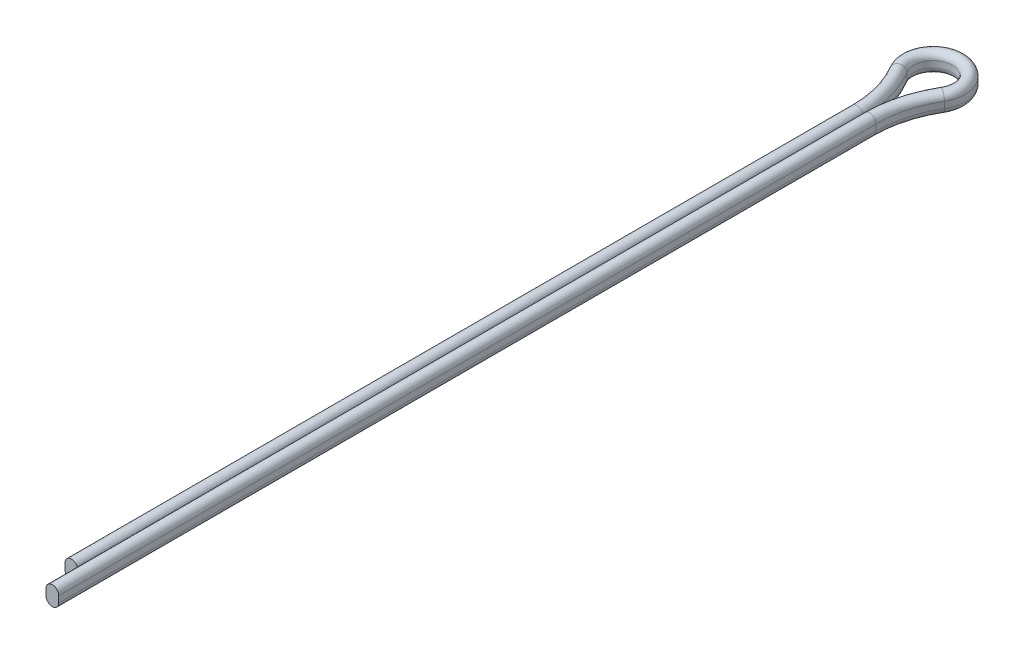
ISO-10303-21;
HEADER;
FILE_DESCRIPTION(('STEP AP214'),'2;1');
FILE_NAME('part.step','',(''),(''),'','','');
FILE_SCHEMA(('AUTOMOTIVE_DESIGN { 1 0 10303 214 1 1 1 1 }'));
ENDSEC;
DATA;
#1=APPLICATION_CONTEXT('core data for automotive mechanical design processes');
#2=APPLICATION_PROTOCOL_DEFINITION('international standard','automotive_design',2000,#1);
#3=PRODUCT_CONTEXT('',#1,'mechanical');
#4=PRODUCT('Part','Part','',(#3));
#5=PRODUCT_RELATED_PRODUCT_CATEGORY('part','',(#4));
#6=PRODUCT_DEFINITION_FORMATION('','',#4);
#7=PRODUCT_DEFINITION_CONTEXT('part definition',#1,'design');
#8=PRODUCT_DEFINITION('design','',#6,#7);
#9=PRODUCT_DEFINITION_SHAPE('','',#8);
#10=(LENGTH_UNIT() NAMED_UNIT(*) SI_UNIT(.MILLI.,.METRE.));
#11=(NAMED_UNIT(*) PLANE_ANGLE_UNIT() SI_UNIT($,.RADIAN.));
#12=(NAMED_UNIT(*) SI_UNIT($,.STERADIAN.) SOLID_ANGLE_UNIT());
#13=UNCERTAINTY_MEASURE_WITH_UNIT(LENGTH_MEASURE(1.E-05),#10,'distance_accuracy_value','');
#14=(GEOMETRIC_REPRESENTATION_CONTEXT(3) GLOBAL_UNCERTAINTY_ASSIGNED_CONTEXT((#13)) GLOBAL_UNIT_ASSIGNED_CONTEXT((#10,
#11,#12)) REPRESENTATION_CONTEXT('',''));
#15=CARTESIAN_POINT('',(0.,0.,0.));
#16=DIRECTION('',(0.,0.,1.));
#17=DIRECTION('',(1.,0.,0.));
#18=AXIS2_PLACEMENT_3D('',#15,#16,#17);
#19=CARTESIAN_POINT('',(0.,-0.2,-51.5));
#20=DIRECTION('',(-1.,0.,0.));
#21=DIRECTION('',(0.,0.,1.));
#22=AXIS2_PLACEMENT_3D('',#19,#20,#21);
#23=PLANE('',#22);
#24=DIRECTION('',(0.,-1.,0.));
#25=VECTOR('',#24,1.);
#26=CARTESIAN_POINT('',(0.,-0.2,-51.5));
#27=LINE('',#26,#25);
#28=CARTESIAN_POINT('',(0.,0.2,-51.5));
#29=VERTEX_POINT('',#28);
#30=CARTESIAN_POINT('',(0.,-0.2,-51.5));
#31=VERTEX_POINT('',#30);
#32=EDGE_CURVE('E225',#29,#31,#27,.T.);
#33=ORIENTED_EDGE('',*,*,#32,.F.);
#34=DIRECTION('',(0.,0.,1.));
#35=VECTOR('',#34,1.);
#36=CARTESIAN_POINT('',(0.,0.2,-51.5));
#37=LINE('',#36,#35);
#38=CARTESIAN_POINT('',(0.,0.2,-1.99999999999998));
#39=VERTEX_POINT('',#38);
#40=EDGE_CURVE('E40',#29,#39,#37,.T.);
#41=ORIENTED_EDGE('',*,*,#40,.T.);
#42=DIRECTION('',(0.,-1.,0.));
#43=VECTOR('',#42,1.);
#44=CARTESIAN_POINT('',(0.,-0.2,-1.99999999999998));
#45=LINE('',#44,#43);
#46=CARTESIAN_POINT('',(0.,-0.2,-1.99999999999998));
#47=VERTEX_POINT('',#46);
#48=EDGE_CURVE('E47',#39,#47,#45,.T.);
#49=ORIENTED_EDGE('',*,*,#48,.T.);
#50=DIRECTION('',(0.,0.,1.));
#51=VECTOR('',#50,1.);
#52=CARTESIAN_POINT('',(0.,-0.2,-51.5));
#53=LINE('',#52,#51);
#54=EDGE_CURVE('E11',#31,#47,#53,.T.);
#55=ORIENTED_EDGE('',*,*,#54,.F.);
#56=EDGE_LOOP('',(#33,#41,#49,#55));
#57=FACE_BOUND('',#56,.T.);
#58=ADVANCED_FACE('F33',(#57),#23,.F.);
#59=CARTESIAN_POINT('',(-0.400000000000008,0.2,-51.5));
#60=DIRECTION('',(0.,0.,1.));
#61=DIRECTION('',(1.,0.,0.));
#62=AXIS2_PLACEMENT_3D('',#59,#60,#61);
#63=CYLINDRICAL_SURFACE('',#62,0.4);
#64=CARTESIAN_POINT('',(-0.400000000000008,0.2,-51.5));
#65=DIRECTION('',(0.,0.,-1.));
#66=DIRECTION('',(-1.,0.,0.));
#67=AXIS2_PLACEMENT_3D('',#64,#65,#66);
#68=CIRCLE('',#67,0.4);
#69=CARTESIAN_POINT('',(-0.800000000000009,0.2,-51.5));
#70=VERTEX_POINT('',#69);
#71=EDGE_CURVE('E222',#70,#29,#68,.T.);
#72=ORIENTED_EDGE('',*,*,#71,.F.);
#73=DIRECTION('',(0.,0.,1.));
#74=VECTOR('',#73,1.);
#75=CARTESIAN_POINT('',(-0.800000000000009,0.2,-51.5));
#76=LINE('',#75,#74);
#77=CARTESIAN_POINT('',(-0.800000000000002,0.2,-1.99999999999998));
#78=VERTEX_POINT('',#77);
#79=EDGE_CURVE('E249',#70,#78,#76,.T.);
#80=ORIENTED_EDGE('',*,*,#79,.T.);
#81=CARTESIAN_POINT('',(-0.400000000000001,0.2,-1.99999999999998));
#82=DIRECTION('',(0.,0.,-1.));
#83=DIRECTION('',(-1.,0.,0.));
#84=AXIS2_PLACEMENT_3D('',#81,#82,#83);
#85=CIRCLE('',#84,0.4);
#86=EDGE_CURVE('E55',#78,#39,#85,.T.);
#87=ORIENTED_EDGE('',*,*,#86,.T.);
#88=ORIENTED_EDGE('',*,*,#40,.F.);
#89=EDGE_LOOP('',(#72,#80,#87,#88));
#90=FACE_BOUND('',#89,.T.);
#91=ADVANCED_FACE('F252',(#90),#63,.T.);
#92=CARTESIAN_POINT('',(-0.800000000000009,-0.2,-51.5));
#93=DIRECTION('',(1.,0.,0.));
#94=DIRECTION('',(0.,0.,-1.));
#95=AXIS2_PLACEMENT_3D('',#92,#93,#94);
#96=PLANE('',#95);
#97=DIRECTION('',(0.,1.,0.));
#98=VECTOR('',#97,1.);
#99=CARTESIAN_POINT('',(-0.800000000000009,-0.2,-51.5));
#100=LINE('',#99,#98);
#101=CARTESIAN_POINT('',(-0.800000000000009,-0.2,-51.5));
#102=VERTEX_POINT('',#101);
#103=EDGE_CURVE('E219',#102,#70,#100,.T.);
#104=ORIENTED_EDGE('',*,*,#103,.F.);
#105=DIRECTION('',(0.,0.,1.));
#106=VECTOR('',#105,1.);
#107=CARTESIAN_POINT('',(-0.800000000000009,-0.2,-51.5));
#108=LINE('',#107,#106);
#109=CARTESIAN_POINT('',(-0.800000000000002,-0.2,-1.99999999999998));
#110=VERTEX_POINT('',#109);
#111=EDGE_CURVE('E246',#102,#110,#108,.T.);
#112=ORIENTED_EDGE('',*,*,#111,.T.);
#113=DIRECTION('',(0.,1.,0.));
#114=VECTOR('',#113,1.);
#115=CARTESIAN_POINT('',(-0.800000000000002,-0.2,-1.99999999999998));
#116=LINE('',#115,#114);
#117=EDGE_CURVE('E242',#110,#78,#116,.T.);
#118=ORIENTED_EDGE('',*,*,#117,.T.);
#119=ORIENTED_EDGE('',*,*,#79,.F.);
#120=EDGE_LOOP('',(#104,#112,#118,#119));
#121=FACE_BOUND('',#120,.T.);
#122=ADVANCED_FACE('F303',(#121),#96,.F.);
#123=CARTESIAN_POINT('',(-0.400000000000008,-0.2,-51.5));
#124=DIRECTION('',(0.,0.,1.));
#125=DIRECTION('',(1.,0.,0.));
#126=AXIS2_PLACEMENT_3D('',#123,#124,#125);
#127=CYLINDRICAL_SURFACE('',#126,0.4);
#128=CARTESIAN_POINT('',(-0.400000000000008,-0.2,-51.5));
#129=DIRECTION('',(0.,0.,-1.));
#130=DIRECTION('',(-1.,0.,0.));
#131=AXIS2_PLACEMENT_3D('',#128,#129,#130);
#132=CIRCLE('',#131,0.4);
#133=EDGE_CURVE('E216',#31,#102,#132,.T.);
#134=ORIENTED_EDGE('',*,*,#133,.F.);
#135=ORIENTED_EDGE('',*,*,#54,.T.);
#136=CARTESIAN_POINT('',(-0.400000000000001,-0.2,-1.99999999999998));
#137=DIRECTION('',(0.,0.,-1.));
#138=DIRECTION('',(-1.,0.,0.));
#139=AXIS2_PLACEMENT_3D('',#136,#137,#138);
#140=CIRCLE('',#139,0.4);
#141=EDGE_CURVE('E240',#47,#110,#140,.T.);
#142=ORIENTED_EDGE('',*,*,#141,.T.);
#143=ORIENTED_EDGE('',*,*,#111,.F.);
#144=EDGE_LOOP('',(#134,#135,#142,#143));
#145=FACE_BOUND('',#144,.T.);
#146=ADVANCED_FACE('F293',(#145),#127,.T.);
#147=CARTESIAN_POINT('',(-7.46666666666668,0.,-51.5));
#148=DIRECTION('',(0.,-1.,0.));
#149=DIRECTION('',(0.,0.,-1.));
#150=AXIS2_PLACEMENT_3D('',#147,#148,#149);
#151=CYLINDRICAL_SURFACE('',#150,7.46666666666666);
#152=DIRECTION('',(0.,-1.,0.));
#153=VECTOR('',#152,1.);
#154=CARTESIAN_POINT('',(-1.03384615384616,-0.2,-55.2907692307692));
#155=LINE('',#154,#153);
#156=CARTESIAN_POINT('',(-1.03384615384616,0.2,-55.2907692307692));
#157=VERTEX_POINT('',#156);
#158=CARTESIAN_POINT('',(-1.03384615384616,-0.2,-55.2907692307692));
#159=VERTEX_POINT('',#158);
#160=EDGE_CURVE('E201',#157,#159,#155,.T.);
#161=ORIENTED_EDGE('',*,*,#160,.F.);
#162=CARTESIAN_POINT('',(-7.46666666666668,0.2,-51.5));
#163=DIRECTION('',(0.,-1.,0.));
#164=DIRECTION('',(0.,0.,-1.));
#165=AXIS2_PLACEMENT_3D('',#162,#163,#164);
#166=CIRCLE('',#165,7.46666666666666);
#167=EDGE_CURVE('E234',#157,#29,#166,.T.);
#168=ORIENTED_EDGE('',*,*,#167,.T.);
#169=ORIENTED_EDGE('',*,*,#32,.T.);
#170=CARTESIAN_POINT('',(-7.46666666666668,-0.2,-51.5));
#171=DIRECTION('',(0.,-1.,0.));
#172=DIRECTION('',(0.,0.,-1.));
#173=AXIS2_PLACEMENT_3D('',#170,#171,#172);
#174=CIRCLE('',#173,7.46666666666666);
#175=EDGE_CURVE('E237',#159,#31,#174,.T.);
#176=ORIENTED_EDGE('',*,*,#175,.F.);
#177=EDGE_LOOP('',(#161,#168,#169,#176));
#178=FACE_BOUND('',#177,.T.);
#179=ADVANCED_FACE('F295',(#178),#151,.T.);
#180=CARTESIAN_POINT('',(-7.46666666666668,0.2,-51.5));
#181=DIRECTION('',(0.,-1.,0.));
#182=DIRECTION('',(0.,0.,-1.));
#183=AXIS2_PLACEMENT_3D('',#180,#181,#182);
#184=TOROIDAL_SURFACE('',#183,7.06666666666667,0.4);
#185=CARTESIAN_POINT('',(-1.37846153846154,0.2,-55.0876923076923));
#186=DIRECTION('',(-0.507692307692317,0.,-0.861538461538456));
#187=DIRECTION('',(-0.861538461538456,0.,0.507692307692317));
#188=AXIS2_PLACEMENT_3D('',#185,#186,#187);
#189=CIRCLE('',#188,0.4);
#190=CARTESIAN_POINT('',(-1.72307692307692,0.2,-54.8846153846154));
#191=VERTEX_POINT('',#190);
#192=EDGE_CURVE('E198',#191,#157,#189,.T.);
#193=ORIENTED_EDGE('',*,*,#192,.F.);
#194=CARTESIAN_POINT('',(-7.46666666666668,0.2,-51.5));
#195=DIRECTION('',(0.,-1.,0.));
#196=DIRECTION('',(0.,0.,-1.));
#197=AXIS2_PLACEMENT_3D('',#194,#195,#196);
#198=CIRCLE('',#197,6.66666666666667);
#199=EDGE_CURVE('E231',#191,#70,#198,.T.);
#200=ORIENTED_EDGE('',*,*,#199,.T.);
#201=ORIENTED_EDGE('',*,*,#71,.T.);
#202=ORIENTED_EDGE('',*,*,#167,.F.);
#203=EDGE_LOOP('',(#193,#200,#201,#202));
#204=FACE_BOUND('',#203,.T.);
#205=ADVANCED_FACE('F260',(#204),#184,.T.);
#206=CARTESIAN_POINT('',(-7.46666666666668,0.,-51.5));
#207=DIRECTION('',(0.,-1.,0.));
#208=DIRECTION('',(0.,0.,-1.));
#209=AXIS2_PLACEMENT_3D('',#206,#207,#208);
#210=CYLINDRICAL_SURFACE('',#209,6.66666666666667);
#211=DIRECTION('',(0.,1.,0.));
#212=VECTOR('',#211,1.);
#213=CARTESIAN_POINT('',(-1.72307692307692,-0.2,-54.8846153846154));
#214=LINE('',#213,#212);
#215=CARTESIAN_POINT('',(-1.72307692307692,-0.2,-54.8846153846154));
#216=VERTEX_POINT('',#215);
#217=EDGE_CURVE('E195',#216,#191,#214,.T.);
#218=ORIENTED_EDGE('',*,*,#217,.F.);
#219=CARTESIAN_POINT('',(-7.46666666666668,-0.2,-51.5));
#220=DIRECTION('',(0.,-1.,0.));
#221=DIRECTION('',(0.,0.,-1.));
#222=AXIS2_PLACEMENT_3D('',#219,#220,#221);
#223=CIRCLE('',#222,6.66666666666667);
#224=EDGE_CURVE('E228',#216,#102,#223,.T.);
#225=ORIENTED_EDGE('',*,*,#224,.T.);
#226=ORIENTED_EDGE('',*,*,#103,.T.);
#227=ORIENTED_EDGE('',*,*,#199,.F.);
#228=EDGE_LOOP('',(#218,#225,#226,#227));
#229=FACE_BOUND('',#228,.T.);
#230=ADVANCED_FACE('F257',(#229),#210,.F.);
#231=CARTESIAN_POINT('',(-7.46666666666668,-0.2,-51.5));
#232=DIRECTION('',(0.,-1.,0.));
#233=DIRECTION('',(0.,0.,-1.));
#234=AXIS2_PLACEMENT_3D('',#231,#232,#233);
#235=TOROIDAL_SURFACE('',#234,7.06666666666667,0.4);
#236=CARTESIAN_POINT('',(-1.37846153846154,-0.2,-55.0876923076923));
#237=DIRECTION('',(-0.507692307692317,0.,-0.861538461538456));
#238=DIRECTION('',(-0.861538461538456,0.,0.507692307692317));
#239=AXIS2_PLACEMENT_3D('',#236,#237,#238);
#240=CIRCLE('',#239,0.4);
#241=EDGE_CURVE('E192',#159,#216,#240,.T.);
#242=ORIENTED_EDGE('',*,*,#241,.F.);
#243=ORIENTED_EDGE('',*,*,#175,.T.);
#244=ORIENTED_EDGE('',*,*,#133,.T.);
#245=ORIENTED_EDGE('',*,*,#224,.F.);
#246=EDGE_LOOP('',(#242,#243,#244,#245));
#247=FACE_BOUND('',#246,.T.);
#248=ADVANCED_FACE('F290',(#247),#235,.T.);
#249=CARTESIAN_POINT('',(0.,0.,-55.9));
#250=DIRECTION('',(0.,1.,0.));
#251=DIRECTION('',(0.,0.,1.));
#252=AXIS2_PLACEMENT_3D('',#249,#250,#251);
#253=CYLINDRICAL_SURFACE('',#252,1.2);
#254=DIRECTION('',(0.,-1.,0.));
#255=VECTOR('',#254,1.);
#256=CARTESIAN_POINT('',(1.03384615384615,-0.2,-55.2907692307692));
#257=LINE('',#256,#255);
#258=CARTESIAN_POINT('',(1.03384615384615,0.2,-55.2907692307692));
#259=VERTEX_POINT('',#258);
#260=CARTESIAN_POINT('',(1.03384615384615,-0.2,-55.2907692307692));
#261=VERTEX_POINT('',#260);
#262=EDGE_CURVE('E135',#259,#261,#257,.T.);
#263=ORIENTED_EDGE('',*,*,#262,.F.);
#264=CARTESIAN_POINT('',(0.,0.2,-55.9));
#265=DIRECTION('',(0.,1.,0.));
#266=DIRECTION('',(0.,0.,1.));
#267=AXIS2_PLACEMENT_3D('',#264,#265,#266);
#268=CIRCLE('',#267,1.2);
#269=EDGE_CURVE('E210',#259,#157,#268,.T.);
#270=ORIENTED_EDGE('',*,*,#269,.T.);
#271=ORIENTED_EDGE('',*,*,#160,.T.);
#272=CARTESIAN_POINT('',(0.,-0.2,-55.9));
#273=DIRECTION('',(0.,1.,0.));
#274=DIRECTION('',(0.,0.,1.));
#275=AXIS2_PLACEMENT_3D('',#272,#273,#274);
#276=CIRCLE('',#275,1.2);
#277=EDGE_CURVE('E213',#261,#159,#276,.T.);
#278=ORIENTED_EDGE('',*,*,#277,.F.);
#279=EDGE_LOOP('',(#263,#270,#271,#278));
#280=FACE_BOUND('',#279,.T.);
#281=ADVANCED_FACE('F285',(#280),#253,.F.);
#282=CARTESIAN_POINT('',(0.,0.2,-55.9));
#283=DIRECTION('',(0.,1.,0.));
#284=DIRECTION('',(0.,0.,1.));
#285=AXIS2_PLACEMENT_3D('',#282,#283,#284);
#286=TOROIDAL_SURFACE('',#285,1.6,0.4);
#287=CARTESIAN_POINT('',(1.37846153846153,0.2,-55.0876923076923));
#288=DIRECTION('',(-0.507692307692307,0.,0.861538461538462));
#289=DIRECTION('',(0.861538461538462,0.,0.507692307692307));
#290=AXIS2_PLACEMENT_3D('',#287,#288,#289);
#291=CIRCLE('',#290,0.4);
#292=CARTESIAN_POINT('',(1.72307692307691,0.2,-54.8846153846154));
#293=VERTEX_POINT('',#292);
#294=EDGE_CURVE('E181',#293,#259,#291,.T.);
#295=ORIENTED_EDGE('',*,*,#294,.F.);
#296=CARTESIAN_POINT('',(0.,0.2,-55.9));
#297=DIRECTION('',(0.,1.,0.));
#298=DIRECTION('',(0.,0.,1.));
#299=AXIS2_PLACEMENT_3D('',#296,#297,#298);
#300=CIRCLE('',#299,2.);
#301=EDGE_CURVE('E207',#293,#191,#300,.T.);
#302=ORIENTED_EDGE('',*,*,#301,.T.);
#303=ORIENTED_EDGE('',*,*,#192,.T.);
#304=ORIENTED_EDGE('',*,*,#269,.F.);
#305=EDGE_LOOP('',(#295,#302,#303,#304));
#306=FACE_BOUND('',#305,.T.);
#307=ADVANCED_FACE('F267',(#306),#286,.T.);
#308=CARTESIAN_POINT('',(0.,0.,-55.9));
#309=DIRECTION('',(0.,1.,0.));
#310=DIRECTION('',(0.,0.,1.));
#311=AXIS2_PLACEMENT_3D('',#308,#309,#310);
#312=CYLINDRICAL_SURFACE('',#311,2.);
#313=DIRECTION('',(0.,1.,0.));
#314=VECTOR('',#313,1.);
#315=CARTESIAN_POINT('',(1.72307692307691,-0.2,-54.8846153846154));
#316=LINE('',#315,#314);
#317=CARTESIAN_POINT('',(1.72307692307691,-0.2,-54.8846153846154));
#318=VERTEX_POINT('',#317);
#319=EDGE_CURVE('E179',#318,#293,#316,.T.);
#320=ORIENTED_EDGE('',*,*,#319,.F.);
#321=CARTESIAN_POINT('',(0.,-0.2,-55.9));
#322=DIRECTION('',(0.,1.,0.));
#323=DIRECTION('',(0.,0.,1.));
#324=AXIS2_PLACEMENT_3D('',#321,#322,#323);
#325=CIRCLE('',#324,2.);
#326=EDGE_CURVE('E204',#318,#216,#325,.T.);
#327=ORIENTED_EDGE('',*,*,#326,.T.);
#328=ORIENTED_EDGE('',*,*,#217,.T.);
#329=ORIENTED_EDGE('',*,*,#301,.F.);
#330=EDGE_LOOP('',(#320,#327,#328,#329));
#331=FACE_BOUND('',#330,.T.);
#332=ADVANCED_FACE('F265',(#331),#312,.T.);
#333=CARTESIAN_POINT('',(0.,-0.2,-55.9));
#334=DIRECTION('',(0.,1.,0.));
#335=DIRECTION('',(0.,0.,1.));
#336=AXIS2_PLACEMENT_3D('',#333,#334,#335);
#337=TOROIDAL_SURFACE('',#336,1.6,0.4);
#338=CARTESIAN_POINT('',(1.37846153846153,-0.2,-55.0876923076923));
#339=DIRECTION('',(-0.507692307692307,0.,0.861538461538462));
#340=DIRECTION('',(0.861538461538462,0.,0.507692307692307));
#341=AXIS2_PLACEMENT_3D('',#338,#339,#340);
#342=CIRCLE('',#341,0.4);
#343=EDGE_CURVE('E131',#261,#318,#342,.T.);
#344=ORIENTED_EDGE('',*,*,#343,.F.);
#345=ORIENTED_EDGE('',*,*,#277,.T.);
#346=ORIENTED_EDGE('',*,*,#241,.T.);
#347=ORIENTED_EDGE('',*,*,#326,.F.);
#348=EDGE_LOOP('',(#344,#345,#346,#347));
#349=FACE_BOUND('',#348,.T.);
#350=ADVANCED_FACE('F287',(#349),#337,.T.);
#351=CARTESIAN_POINT('',(7.46666666666666,0.,-51.5));
#352=DIRECTION('',(0.,-1.,0.));
#353=DIRECTION('',(0.,0.,-1.));
#354=AXIS2_PLACEMENT_3D('',#351,#352,#353);
#355=CYLINDRICAL_SURFACE('',#354,7.46666666666667);
#356=DIRECTION('',(0.,-1.,0.));
#357=VECTOR('',#356,1.);
#358=CARTESIAN_POINT('',(0.,-0.2,-51.5));
#359=LINE('',#358,#357);
#360=CARTESIAN_POINT('',(0.,0.2,-51.5));
#361=VERTEX_POINT('',#360);
#362=CARTESIAN_POINT('',(0.,-0.2,-51.5));
#363=VERTEX_POINT('',#362);
#364=EDGE_CURVE('E155',#361,#363,#359,.T.);
#365=ORIENTED_EDGE('',*,*,#364,.F.);
#366=CARTESIAN_POINT('',(7.46666666666666,0.2,-51.5));
#367=DIRECTION('',(0.,-1.,0.));
#368=DIRECTION('',(0.,0.,-1.));
#369=AXIS2_PLACEMENT_3D('',#366,#367,#368);
#370=CIRCLE('',#369,7.46666666666667);
#371=EDGE_CURVE('E187',#361,#259,#370,.T.);
#372=ORIENTED_EDGE('',*,*,#371,.T.);
#373=ORIENTED_EDGE('',*,*,#262,.T.);
#374=CARTESIAN_POINT('',(7.46666666666666,-0.2,-51.5));
#375=DIRECTION('',(0.,-1.,0.));
#376=DIRECTION('',(0.,0.,-1.));
#377=AXIS2_PLACEMENT_3D('',#374,#375,#376);
#378=CIRCLE('',#377,7.46666666666667);
#379=EDGE_CURVE('E190',#363,#261,#378,.T.);
#380=ORIENTED_EDGE('',*,*,#379,.F.);
#381=EDGE_LOOP('',(#365,#372,#373,#380));
#382=FACE_BOUND('',#381,.T.);
#383=ADVANCED_FACE('F283',(#382),#355,.T.);
#384=CARTESIAN_POINT('',(7.46666666666666,0.2,-51.5));
#385=DIRECTION('',(0.,-1.,0.));
#386=DIRECTION('',(0.,0.,-1.));
#387=AXIS2_PLACEMENT_3D('',#384,#385,#386);
#388=TOROIDAL_SURFACE('',#387,7.06666666666667,0.4);
#389=CARTESIAN_POINT('',(0.399999999999991,0.2,-51.5));
#390=DIRECTION('',(0.,0.,1.));
#391=DIRECTION('',(1.,0.,0.));
#392=AXIS2_PLACEMENT_3D('',#389,#390,#391);
#393=CIRCLE('',#392,0.4);
#394=CARTESIAN_POINT('',(0.799999999999991,0.2,-51.5));
#395=VERTEX_POINT('',#394);
#396=EDGE_CURVE('E144',#395,#361,#393,.T.);
#397=ORIENTED_EDGE('',*,*,#396,.F.);
#398=CARTESIAN_POINT('',(7.46666666666666,0.2,-51.5));
#399=DIRECTION('',(0.,-1.,0.));
#400=DIRECTION('',(0.,0.,-1.));
#401=AXIS2_PLACEMENT_3D('',#398,#399,#400);
#402=CIRCLE('',#401,6.66666666666667);
#403=EDGE_CURVE('E134',#395,#293,#402,.T.);
#404=ORIENTED_EDGE('',*,*,#403,.T.);
#405=ORIENTED_EDGE('',*,*,#294,.T.);
#406=ORIENTED_EDGE('',*,*,#371,.F.);
#407=EDGE_LOOP('',(#397,#404,#405,#406));
#408=FACE_BOUND('',#407,.T.);
#409=ADVANCED_FACE('F270',(#408),#388,.T.);
#410=CARTESIAN_POINT('',(7.46666666666666,0.,-51.5));
#411=DIRECTION('',(0.,-1.,0.));
#412=DIRECTION('',(0.,0.,-1.));
#413=AXIS2_PLACEMENT_3D('',#410,#411,#412);
#414=CYLINDRICAL_SURFACE('',#413,6.66666666666667);
#415=DIRECTION('',(0.,1.,0.));
#416=VECTOR('',#415,1.);
#417=CARTESIAN_POINT('',(0.799999999999991,-0.2,-51.5));
#418=LINE('',#417,#416);
#419=CARTESIAN_POINT('',(0.799999999999991,-0.2,-51.5));
#420=VERTEX_POINT('',#419);
#421=EDGE_CURVE('E138',#420,#395,#418,.T.);
#422=ORIENTED_EDGE('',*,*,#421,.F.);
#423=CARTESIAN_POINT('',(7.46666666666666,-0.2,-51.5));
#424=DIRECTION('',(0.,-1.,0.));
#425=DIRECTION('',(0.,0.,-1.));
#426=AXIS2_PLACEMENT_3D('',#423,#424,#425);
#427=CIRCLE('',#426,6.66666666666667);
#428=EDGE_CURVE('E123',#420,#318,#427,.T.);
#429=ORIENTED_EDGE('',*,*,#428,.T.);
#430=ORIENTED_EDGE('',*,*,#319,.T.);
#431=ORIENTED_EDGE('',*,*,#403,.F.);
#432=EDGE_LOOP('',(#422,#429,#430,#431));
#433=FACE_BOUND('',#432,.T.);
#434=ADVANCED_FACE('F140',(#433),#414,.F.);
#435=CARTESIAN_POINT('',(7.46666666666666,-0.2,-51.5));
#436=DIRECTION('',(0.,-1.,0.));
#437=DIRECTION('',(0.,0.,-1.));
#438=AXIS2_PLACEMENT_3D('',#435,#436,#437);
#439=TOROIDAL_SURFACE('',#438,7.06666666666667,0.4);
#440=CARTESIAN_POINT('',(0.399999999999991,-0.2,-51.5));
#441=DIRECTION('',(0.,0.,1.));
#442=DIRECTION('',(1.,0.,0.));
#443=AXIS2_PLACEMENT_3D('',#440,#441,#442);
#444=CIRCLE('',#443,0.4);
#445=EDGE_CURVE('E128',#363,#420,#444,.T.);
#446=ORIENTED_EDGE('',*,*,#445,.F.);
#447=ORIENTED_EDGE('',*,*,#379,.T.);
#448=ORIENTED_EDGE('',*,*,#343,.T.);
#449=ORIENTED_EDGE('',*,*,#428,.F.);
#450=EDGE_LOOP('',(#446,#447,#448,#449));
#451=FACE_BOUND('',#450,.T.);
#452=ADVANCED_FACE('F125',(#451),#439,.T.);
#453=CARTESIAN_POINT('',(0.399999999999991,-0.2,-51.5));
#454=DIRECTION('',(0.,0.,1.));
#455=DIRECTION('',(1.,0.,0.));
#456=AXIS2_PLACEMENT_3D('',#453,#454,#455);
#457=CYLINDRICAL_SURFACE('',#456,0.4);
#458=CARTESIAN_POINT('',(0.4,-0.2,0.));
#459=DIRECTION('',(0.,0.,1.));
#460=DIRECTION('',(1.,0.,0.));
#461=AXIS2_PLACEMENT_3D('',#458,#459,#460);
#462=CIRCLE('',#461,0.4);
#463=CARTESIAN_POINT('',(0.,-0.2,0.));
#464=VERTEX_POINT('',#463);
#465=CARTESIAN_POINT('',(0.799999999999999,-0.2,0.));
#466=VERTEX_POINT('',#465);
#467=EDGE_CURVE('E169',#464,#466,#462,.T.);
#468=ORIENTED_EDGE('',*,*,#467,.F.);
#469=DIRECTION('',(0.,0.,1.));
#470=VECTOR('',#469,1.);
#471=CARTESIAN_POINT('',(0.,-0.2,-51.5));
#472=LINE('',#471,#470);
#473=EDGE_CURVE('E158',#363,#464,#472,.T.);
#474=ORIENTED_EDGE('',*,*,#473,.F.);
#475=ORIENTED_EDGE('',*,*,#445,.T.);
#476=DIRECTION('',(0.,0.,1.));
#477=VECTOR('',#476,1.);
#478=CARTESIAN_POINT('',(0.799999999999991,-0.2,-51.5));
#479=LINE('',#478,#477);
#480=EDGE_CURVE('E147',#420,#466,#479,.T.);
#481=ORIENTED_EDGE('',*,*,#480,.T.);
#482=EDGE_LOOP('',(#468,#474,#475,#481));
#483=FACE_BOUND('',#482,.T.);
#484=ADVANCED_FACE('F157',(#483),#457,.T.);
#485=CARTESIAN_POINT('',(0.,-0.2,-51.5));
#486=DIRECTION('',(-1.,0.,0.));
#487=DIRECTION('',(0.,0.,1.));
#488=AXIS2_PLACEMENT_3D('',#485,#486,#487);
#489=PLANE('',#488);
#490=DIRECTION('',(0.,-1.,0.));
#491=VECTOR('',#490,1.);
#492=CARTESIAN_POINT('',(0.,-0.2,0.));
#493=LINE('',#492,#491);
#494=CARTESIAN_POINT('',(0.,0.2,0.));
#495=VERTEX_POINT('',#494);
#496=EDGE_CURVE('E160',#495,#464,#493,.T.);
#497=ORIENTED_EDGE('',*,*,#496,.F.);
#498=DIRECTION('',(0.,0.,1.));
#499=VECTOR('',#498,1.);
#500=CARTESIAN_POINT('',(0.,0.2,-51.5));
#501=LINE('',#500,#499);
#502=EDGE_CURVE('E175',#361,#495,#501,.T.);
#503=ORIENTED_EDGE('',*,*,#502,.F.);
#504=ORIENTED_EDGE('',*,*,#364,.T.);
#505=ORIENTED_EDGE('',*,*,#473,.T.);
#506=EDGE_LOOP('',(#497,#503,#504,#505));
#507=FACE_BOUND('',#506,.T.);
#508=ADVANCED_FACE('F281',(#507),#489,.T.);
#509=CARTESIAN_POINT('',(0.399999999999991,0.2,-51.5));
#510=DIRECTION('',(0.,0.,1.));
#511=DIRECTION('',(1.,0.,0.));
#512=AXIS2_PLACEMENT_3D('',#509,#510,#511);
#513=CYLINDRICAL_SURFACE('',#512,0.4);
#514=CARTESIAN_POINT('',(0.4,0.2,0.));
#515=DIRECTION('',(0.,0.,1.));
#516=DIRECTION('',(1.,0.,0.));
#517=AXIS2_PLACEMENT_3D('',#514,#515,#516);
#518=CIRCLE('',#517,0.4);
#519=CARTESIAN_POINT('',(0.799999999999999,0.2,0.));
#520=VERTEX_POINT('',#519);
#521=EDGE_CURVE('E163',#520,#495,#518,.T.);
#522=ORIENTED_EDGE('',*,*,#521,.F.);
#523=DIRECTION('',(0.,0.,1.));
#524=VECTOR('',#523,1.);
#525=CARTESIAN_POINT('',(0.799999999999991,0.2,-51.5));
#526=LINE('',#525,#524);
#527=EDGE_CURVE('E154',#395,#520,#526,.T.);
#528=ORIENTED_EDGE('',*,*,#527,.F.);
#529=ORIENTED_EDGE('',*,*,#396,.T.);
#530=ORIENTED_EDGE('',*,*,#502,.T.);
#531=EDGE_LOOP('',(#522,#528,#529,#530));
#532=FACE_BOUND('',#531,.T.);
#533=ADVANCED_FACE('F275',(#532),#513,.T.);
#534=CARTESIAN_POINT('',(0.799999999999991,-0.2,-51.5));
#535=DIRECTION('',(1.,0.,0.));
#536=DIRECTION('',(0.,0.,-1.));
#537=AXIS2_PLACEMENT_3D('',#534,#535,#536);
#538=PLANE('',#537);
#539=DIRECTION('',(0.,1.,0.));
#540=VECTOR('',#539,1.);
#541=CARTESIAN_POINT('',(0.799999999999999,-0.2,0.));
#542=LINE('',#541,#540);
#543=EDGE_CURVE('E150',#466,#520,#542,.T.);
#544=ORIENTED_EDGE('',*,*,#543,.F.);
#545=ORIENTED_EDGE('',*,*,#480,.F.);
#546=ORIENTED_EDGE('',*,*,#421,.T.);
#547=ORIENTED_EDGE('',*,*,#527,.T.);
#548=EDGE_LOOP('',(#544,#545,#546,#547));
#549=FACE_BOUND('',#548,.T.);
#550=ADVANCED_FACE('F148',(#549),#538,.T.);
#551=CARTESIAN_POINT('',(-0.400000000000001,-0.2,-1.99999999999998));
#552=DIRECTION('',(0.,0.,-1.));
#553=DIRECTION('',(-1.,0.,0.));
#554=AXIS2_PLACEMENT_3D('',#551,#552,#553);
#555=PLANE('',#554);
#556=ORIENTED_EDGE('',*,*,#141,.F.);
#557=ORIENTED_EDGE('',*,*,#48,.F.);
#558=ORIENTED_EDGE('',*,*,#86,.F.);
#559=ORIENTED_EDGE('',*,*,#117,.F.);
#560=EDGE_LOOP('',(#556,#557,#558,#559));
#561=FACE_BOUND('',#560,.T.);
#562=ADVANCED_FACE('F442',(#561),#555,.F.);
#563=CARTESIAN_POINT('',(0.4,-0.2,0.));
#564=DIRECTION('',(0.,0.,1.));
#565=DIRECTION('',(1.,0.,0.));
#566=AXIS2_PLACEMENT_3D('',#563,#564,#565);
#567=PLANE('',#566);
#568=ORIENTED_EDGE('',*,*,#467,.T.);
#569=ORIENTED_EDGE('',*,*,#543,.T.);
#570=ORIENTED_EDGE('',*,*,#521,.T.);
#571=ORIENTED_EDGE('',*,*,#496,.T.);
#572=EDGE_LOOP('',(#568,#569,#570,#571));
#573=FACE_BOUND('',#572,.T.);
#574=ADVANCED_FACE('F279',(#573),#567,.T.);
#575=CLOSED_SHELL('',(#58,#91,#122,#146,#179,#205,#230,#248,#281,#307,#332,#350,#383,#409,#434,
#452,#484,#508,#533,#550,#562,#574));
#576=MANIFOLD_SOLID_BREP('B2',#575);
#577=ADVANCED_BREP_SHAPE_REPRESENTATION('',(#18,#576),#14);
#578=SHAPE_DEFINITION_REPRESENTATION(#9,#577);
ENDSEC;
END-ISO-10303-21;
